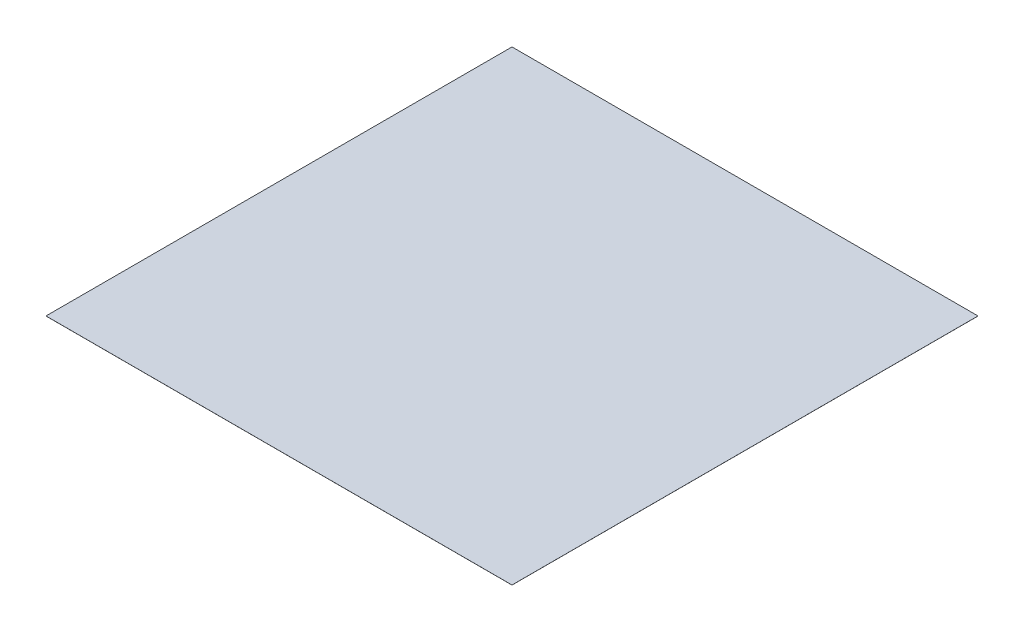
ISO-10303-21;
HEADER;
FILE_DESCRIPTION(('STEP AP214'),'2;1');
FILE_NAME('part.step','',(''),(''),'','','');
FILE_SCHEMA(('AUTOMOTIVE_DESIGN { 1 0 10303 214 1 1 1 1 }'));
ENDSEC;
DATA;
#1=APPLICATION_CONTEXT('core data for automotive mechanical design processes');
#2=APPLICATION_PROTOCOL_DEFINITION('international standard','automotive_design',2000,#1);
#3=PRODUCT_CONTEXT('',#1,'mechanical');
#4=PRODUCT('Part','Part','',(#3));
#5=PRODUCT_RELATED_PRODUCT_CATEGORY('part','',(#4));
#6=PRODUCT_DEFINITION_FORMATION('','',#4);
#7=PRODUCT_DEFINITION_CONTEXT('part definition',#1,'design');
#8=PRODUCT_DEFINITION('design','',#6,#7);
#9=PRODUCT_DEFINITION_SHAPE('','',#8);
#10=(LENGTH_UNIT() NAMED_UNIT(*) SI_UNIT(.MILLI.,.METRE.));
#11=(NAMED_UNIT(*) PLANE_ANGLE_UNIT() SI_UNIT($,.RADIAN.));
#12=(NAMED_UNIT(*) SI_UNIT($,.STERADIAN.) SOLID_ANGLE_UNIT());
#13=UNCERTAINTY_MEASURE_WITH_UNIT(LENGTH_MEASURE(1.E-05),#10,'distance_accuracy_value','');
#14=(GEOMETRIC_REPRESENTATION_CONTEXT(3) GLOBAL_UNCERTAINTY_ASSIGNED_CONTEXT((#13)) GLOBAL_UNIT_ASSIGNED_CONTEXT((#10,
#11,#12)) REPRESENTATION_CONTEXT('',''));
#15=CARTESIAN_POINT('',(0.,0.,0.));
#16=DIRECTION('',(0.,0.,1.));
#17=DIRECTION('',(1.,0.,0.));
#18=AXIS2_PLACEMENT_3D('',#15,#16,#17);
#19=CARTESIAN_POINT('',(3000.,1.,3000.));
#20=DIRECTION('',(-1.,0.,0.));
#21=DIRECTION('',(0.,0.,1.));
#22=AXIS2_PLACEMENT_3D('',#19,#20,#21);
#23=PLANE('',#22);
#24=DIRECTION('',(0.,0.,-1.));
#25=VECTOR('',#24,1.);
#26=CARTESIAN_POINT('',(3000.,0.,3000.));
#27=LINE('',#26,#25);
#28=CARTESIAN_POINT('',(3000.,0.,3000.));
#29=VERTEX_POINT('',#28);
#30=CARTESIAN_POINT('',(3000.,0.,-3000.));
#31=VERTEX_POINT('',#30);
#32=EDGE_CURVE('E99',#29,#31,#27,.T.);
#33=ORIENTED_EDGE('',*,*,#32,.T.);
#34=DIRECTION('',(0.,-1.,0.));
#35=VECTOR('',#34,1.);
#36=CARTESIAN_POINT('',(3000.,1.,-3000.));
#37=LINE('',#36,#35);
#38=CARTESIAN_POINT('',(3000.,1.,-3000.));
#39=VERTEX_POINT('',#38);
#40=EDGE_CURVE('E11',#39,#31,#37,.T.);
#41=ORIENTED_EDGE('',*,*,#40,.F.);
#42=DIRECTION('',(0.,0.,-1.));
#43=VECTOR('',#42,1.);
#44=CARTESIAN_POINT('',(3000.,1.,3000.));
#45=LINE('',#44,#43);
#46=CARTESIAN_POINT('',(3000.,1.,3000.));
#47=VERTEX_POINT('',#46);
#48=EDGE_CURVE('E87',#47,#39,#45,.T.);
#49=ORIENTED_EDGE('',*,*,#48,.F.);
#50=DIRECTION('',(0.,-1.,0.));
#51=VECTOR('',#50,1.);
#52=CARTESIAN_POINT('',(3000.,1.,3000.));
#53=LINE('',#52,#51);
#54=EDGE_CURVE('E95',#47,#29,#53,.T.);
#55=ORIENTED_EDGE('',*,*,#54,.T.);
#56=EDGE_LOOP('',(#33,#41,#49,#55));
#57=FACE_BOUND('',#56,.T.);
#58=ADVANCED_FACE('F36',(#57),#23,.F.);
#59=CARTESIAN_POINT('',(-3000.,1.,-3000.));
#60=DIRECTION('',(0.,0.,1.));
#61=DIRECTION('',(1.,0.,0.));
#62=AXIS2_PLACEMENT_3D('',#59,#60,#61);
#63=PLANE('',#62);
#64=DIRECTION('',(-1.,0.,0.));
#65=VECTOR('',#64,1.);
#66=CARTESIAN_POINT('',(-3000.,0.,-3000.));
#67=LINE('',#66,#65);
#68=CARTESIAN_POINT('',(-3000.,0.,-3000.));
#69=VERTEX_POINT('',#68);
#70=EDGE_CURVE('E91',#31,#69,#67,.T.);
#71=ORIENTED_EDGE('',*,*,#70,.T.);
#72=DIRECTION('',(0.,-1.,0.));
#73=VECTOR('',#72,1.);
#74=CARTESIAN_POINT('',(-3000.,1.,-3000.));
#75=LINE('',#74,#73);
#76=CARTESIAN_POINT('',(-3000.,1.,-3000.));
#77=VERTEX_POINT('',#76);
#78=EDGE_CURVE('E44',#77,#69,#75,.T.);
#79=ORIENTED_EDGE('',*,*,#78,.F.);
#80=DIRECTION('',(-1.,0.,0.));
#81=VECTOR('',#80,1.);
#82=CARTESIAN_POINT('',(-3000.,1.,-3000.));
#83=LINE('',#82,#81);
#84=EDGE_CURVE('E82',#39,#77,#83,.T.);
#85=ORIENTED_EDGE('',*,*,#84,.F.);
#86=ORIENTED_EDGE('',*,*,#40,.T.);
#87=EDGE_LOOP('',(#71,#79,#85,#86));
#88=FACE_BOUND('',#87,.T.);
#89=ADVANCED_FACE('F90',(#88),#63,.F.);
#90=CARTESIAN_POINT('',(-3000.,1.,3000.));
#91=DIRECTION('',(1.,0.,0.));
#92=DIRECTION('',(0.,0.,-1.));
#93=AXIS2_PLACEMENT_3D('',#90,#91,#92);
#94=PLANE('',#93);
#95=DIRECTION('',(0.,0.,1.));
#96=VECTOR('',#95,1.);
#97=CARTESIAN_POINT('',(-3000.,0.,3000.));
#98=LINE('',#97,#96);
#99=CARTESIAN_POINT('',(-3000.,0.,3000.));
#100=VERTEX_POINT('',#99);
#101=EDGE_CURVE('E69',#69,#100,#98,.T.);
#102=ORIENTED_EDGE('',*,*,#101,.T.);
#103=DIRECTION('',(0.,-1.,0.));
#104=VECTOR('',#103,1.);
#105=CARTESIAN_POINT('',(-3000.,1.,3000.));
#106=LINE('',#105,#104);
#107=CARTESIAN_POINT('',(-3000.,1.,3000.));
#108=VERTEX_POINT('',#107);
#109=EDGE_CURVE('E92',#108,#100,#106,.T.);
#110=ORIENTED_EDGE('',*,*,#109,.F.);
#111=DIRECTION('',(0.,0.,1.));
#112=VECTOR('',#111,1.);
#113=CARTESIAN_POINT('',(-3000.,1.,3000.));
#114=LINE('',#113,#112);
#115=EDGE_CURVE('E85',#77,#108,#114,.T.);
#116=ORIENTED_EDGE('',*,*,#115,.F.);
#117=ORIENTED_EDGE('',*,*,#78,.T.);
#118=EDGE_LOOP('',(#102,#110,#116,#117));
#119=FACE_BOUND('',#118,.T.);
#120=ADVANCED_FACE('F93',(#119),#94,.F.);
#121=CARTESIAN_POINT('',(-3000.,1.,3000.));
#122=DIRECTION('',(0.,0.,-1.));
#123=DIRECTION('',(-1.,0.,0.));
#124=AXIS2_PLACEMENT_3D('',#121,#122,#123);
#125=PLANE('',#124);
#126=DIRECTION('',(1.,0.,0.));
#127=VECTOR('',#126,1.);
#128=CARTESIAN_POINT('',(-3000.,0.,3000.));
#129=LINE('',#128,#127);
#130=EDGE_CURVE('E75',#100,#29,#129,.T.);
#131=ORIENTED_EDGE('',*,*,#130,.T.);
#132=ORIENTED_EDGE('',*,*,#54,.F.);
#133=DIRECTION('',(1.,0.,0.));
#134=VECTOR('',#133,1.);
#135=CARTESIAN_POINT('',(-3000.,1.,3000.));
#136=LINE('',#135,#134);
#137=EDGE_CURVE('E52',#108,#47,#136,.T.);
#138=ORIENTED_EDGE('',*,*,#137,.F.);
#139=ORIENTED_EDGE('',*,*,#109,.T.);
#140=EDGE_LOOP('',(#131,#132,#138,#139));
#141=FACE_BOUND('',#140,.T.);
#142=ADVANCED_FACE('F106',(#141),#125,.F.);
#143=CARTESIAN_POINT('',(0.,1.,0.));
#144=DIRECTION('',(0.,-1.,0.));
#145=DIRECTION('',(0.,0.,-1.));
#146=AXIS2_PLACEMENT_3D('',#143,#144,#145);
#147=PLANE('',#146);
#148=ORIENTED_EDGE('',*,*,#48,.T.);
#149=ORIENTED_EDGE('',*,*,#84,.T.);
#150=ORIENTED_EDGE('',*,*,#115,.T.);
#151=ORIENTED_EDGE('',*,*,#137,.T.);
#152=EDGE_LOOP('',(#148,#149,#150,#151));
#153=FACE_BOUND('',#152,.T.);
#154=ADVANCED_FACE('F83',(#153),#147,.F.);
#155=CARTESIAN_POINT('',(0.,0.,0.));
#156=DIRECTION('',(0.,-1.,0.));
#157=DIRECTION('',(0.,0.,-1.));
#158=AXIS2_PLACEMENT_3D('',#155,#156,#157);
#159=PLANE('',#158);
#160=ORIENTED_EDGE('',*,*,#32,.F.);
#161=ORIENTED_EDGE('',*,*,#130,.F.);
#162=ORIENTED_EDGE('',*,*,#101,.F.);
#163=ORIENTED_EDGE('',*,*,#70,.F.);
#164=EDGE_LOOP('',(#160,#161,#162,#163));
#165=FACE_BOUND('',#164,.T.);
#166=ADVANCED_FACE('F109',(#165),#159,.T.);
#167=CLOSED_SHELL('',(#58,#89,#120,#142,#154,#166));
#168=MANIFOLD_SOLID_BREP('B2',#167);
#169=ADVANCED_BREP_SHAPE_REPRESENTATION('',(#18,#168),#14);
#170=SHAPE_DEFINITION_REPRESENTATION(#9,#169);
ENDSEC;
END-ISO-10303-21;
